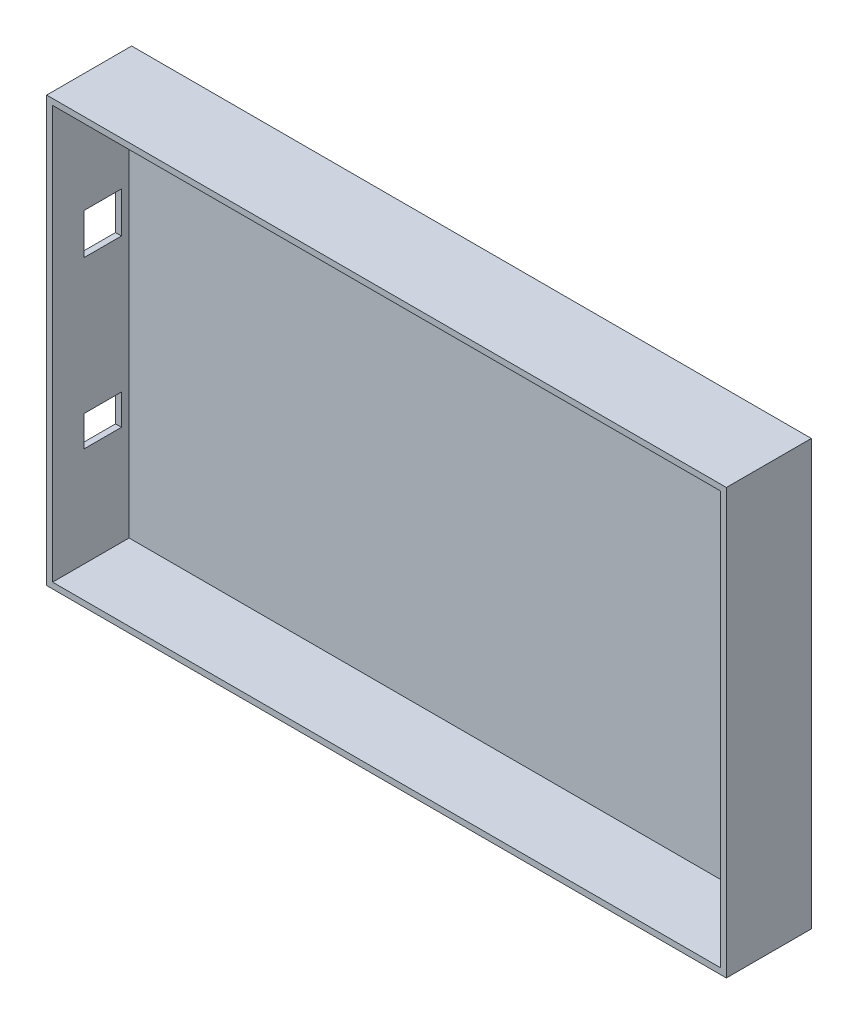
ISO-10303-21;
HEADER;
FILE_DESCRIPTION(('STEP AP214'),'2;1');
FILE_NAME('part.step','',(''),(''),'','','');
FILE_SCHEMA(('AUTOMOTIVE_DESIGN { 1 0 10303 214 1 1 1 1 }'));
ENDSEC;
DATA;
#1=APPLICATION_CONTEXT('core data for automotive mechanical design processes');
#2=APPLICATION_PROTOCOL_DEFINITION('international standard','automotive_design',2000,#1);
#3=PRODUCT_CONTEXT('',#1,'mechanical');
#4=PRODUCT('Part','Part','',(#3));
#5=PRODUCT_RELATED_PRODUCT_CATEGORY('part','',(#4));
#6=PRODUCT_DEFINITION_FORMATION('','',#4);
#7=PRODUCT_DEFINITION_CONTEXT('part definition',#1,'design');
#8=PRODUCT_DEFINITION('design','',#6,#7);
#9=PRODUCT_DEFINITION_SHAPE('','',#8);
#10=(LENGTH_UNIT() NAMED_UNIT(*) SI_UNIT(.MILLI.,.METRE.));
#11=(NAMED_UNIT(*) PLANE_ANGLE_UNIT() SI_UNIT($,.RADIAN.));
#12=(NAMED_UNIT(*) SI_UNIT($,.STERADIAN.) SOLID_ANGLE_UNIT());
#13=UNCERTAINTY_MEASURE_WITH_UNIT(LENGTH_MEASURE(1.E-05),#10,'distance_accuracy_value','');
#14=(GEOMETRIC_REPRESENTATION_CONTEXT(3) GLOBAL_UNCERTAINTY_ASSIGNED_CONTEXT((#13)) GLOBAL_UNIT_ASSIGNED_CONTEXT((#10,
#11,#12)) REPRESENTATION_CONTEXT('',''));
#15=CARTESIAN_POINT('',(0.,0.,0.));
#16=DIRECTION('',(0.,0.,1.));
#17=DIRECTION('',(1.,0.,0.));
#18=AXIS2_PLACEMENT_3D('',#15,#16,#17);
#19=CARTESIAN_POINT('',(0.,0.,25.4));
#20=DIRECTION('',(1.,0.,0.));
#21=DIRECTION('',(0.,0.,-1.));
#22=AXIS2_PLACEMENT_3D('',#19,#20,#21);
#23=PLANE('',#22);
#24=DIRECTION('',(0.,0.,-1.));
#25=VECTOR('',#24,1.);
#26=CARTESIAN_POINT('',(0.,40.7249020119005,16.002));
#27=LINE('',#26,#25);
#28=CARTESIAN_POINT('',(0.,40.7249020119005,16.002));
#29=VERTEX_POINT('',#28);
#30=CARTESIAN_POINT('',(0.,40.7249020119005,4.826));
#31=VERTEX_POINT('',#30);
#32=EDGE_CURVE('E171',#29,#31,#27,.T.);
#33=ORIENTED_EDGE('',*,*,#32,.F.);
#34=DIRECTION('',(0.,1.,0.));
#35=VECTOR('',#34,1.);
#36=CARTESIAN_POINT('',(0.,40.7249020119005,16.002));
#37=LINE('',#36,#35);
#38=CARTESIAN_POINT('',(0.,31.5809020119005,16.002));
#39=VERTEX_POINT('',#38);
#40=EDGE_CURVE('E46',#39,#29,#37,.T.);
#41=ORIENTED_EDGE('',*,*,#40,.F.);
#42=DIRECTION('',(0.,0.,1.));
#43=VECTOR('',#42,1.);
#44=CARTESIAN_POINT('',(0.,31.5809020119005,16.002));
#45=LINE('',#44,#43);
#46=CARTESIAN_POINT('',(0.,31.5809020119005,4.826));
#47=VERTEX_POINT('',#46);
#48=EDGE_CURVE('E162',#47,#39,#45,.T.);
#49=ORIENTED_EDGE('',*,*,#48,.F.);
#50=DIRECTION('',(0.,-1.,0.));
#51=VECTOR('',#50,1.);
#52=CARTESIAN_POINT('',(0.,40.7249020119005,4.826));
#53=LINE('',#52,#51);
#54=EDGE_CURVE('E165',#31,#47,#53,.T.);
#55=ORIENTED_EDGE('',*,*,#54,.F.);
#56=EDGE_LOOP('',(#33,#41,#49,#55));
#57=FACE_BOUND('',#56,.T.);
#58=DIRECTION('',(0.,0.,-1.));
#59=VECTOR('',#58,1.);
#60=CARTESIAN_POINT('',(0.,93.3029020119005,16.002));
#61=LINE('',#60,#59);
#62=CARTESIAN_POINT('',(0.,93.3029020119005,16.002));
#63=VERTEX_POINT('',#62);
#64=CARTESIAN_POINT('',(0.,93.3029020119005,4.826));
#65=VERTEX_POINT('',#64);
#66=EDGE_CURVE('E196',#63,#65,#61,.T.);
#67=ORIENTED_EDGE('',*,*,#66,.F.);
#68=DIRECTION('',(0.,1.,0.));
#69=VECTOR('',#68,1.);
#70=CARTESIAN_POINT('',(0.,93.3029020119005,16.002));
#71=LINE('',#70,#69);
#72=CARTESIAN_POINT('',(0.,81.1109020119005,16.002));
#73=VERTEX_POINT('',#72);
#74=EDGE_CURVE('E177',#73,#63,#71,.T.);
#75=ORIENTED_EDGE('',*,*,#74,.F.);
#76=DIRECTION('',(0.,0.,1.));
#77=VECTOR('',#76,1.);
#78=CARTESIAN_POINT('',(0.,81.1109020119005,16.002));
#79=LINE('',#78,#77);
#80=CARTESIAN_POINT('',(0.,81.1109020119005,4.826));
#81=VERTEX_POINT('',#80);
#82=EDGE_CURVE('E185',#81,#73,#79,.T.);
#83=ORIENTED_EDGE('',*,*,#82,.F.);
#84=DIRECTION('',(0.,-1.,0.));
#85=VECTOR('',#84,1.);
#86=CARTESIAN_POINT('',(0.,93.3029020119005,4.826));
#87=LINE('',#86,#85);
#88=EDGE_CURVE('E199',#65,#81,#87,.T.);
#89=ORIENTED_EDGE('',*,*,#88,.F.);
#90=EDGE_LOOP('',(#67,#75,#83,#89));
#91=FACE_BOUND('',#90,.T.);
#92=DIRECTION('',(0.,-1.,0.));
#93=VECTOR('',#92,1.);
#94=CARTESIAN_POINT('',(0.,0.,0.));
#95=LINE('',#94,#93);
#96=CARTESIAN_POINT('',(0.,127.,0.));
#97=VERTEX_POINT('',#96);
#98=CARTESIAN_POINT('',(0.,0.,0.));
#99=VERTEX_POINT('',#98);
#100=EDGE_CURVE('E238',#97,#99,#95,.T.);
#101=ORIENTED_EDGE('',*,*,#100,.T.);
#102=DIRECTION('',(0.,0.,-1.));
#103=VECTOR('',#102,1.);
#104=CARTESIAN_POINT('',(0.,0.,25.4));
#105=LINE('',#104,#103);
#106=CARTESIAN_POINT('',(0.,0.,25.4));
#107=VERTEX_POINT('',#106);
#108=EDGE_CURVE('E11',#107,#99,#105,.T.);
#109=ORIENTED_EDGE('',*,*,#108,.F.);
#110=DIRECTION('',(0.,-1.,0.));
#111=VECTOR('',#110,1.);
#112=CARTESIAN_POINT('',(0.,0.,25.4));
#113=LINE('',#112,#111);
#114=CARTESIAN_POINT('',(0.,127.,25.4));
#115=VERTEX_POINT('',#114);
#116=EDGE_CURVE('E245',#115,#107,#113,.T.);
#117=ORIENTED_EDGE('',*,*,#116,.F.);
#118=DIRECTION('',(0.,0.,-1.));
#119=VECTOR('',#118,1.);
#120=CARTESIAN_POINT('',(0.,127.,25.4));
#121=LINE('',#120,#119);
#122=EDGE_CURVE('E255',#115,#97,#121,.T.);
#123=ORIENTED_EDGE('',*,*,#122,.T.);
#124=EDGE_LOOP('',(#101,#109,#117,#123));
#125=FACE_BOUND('',#124,.T.);
#126=ADVANCED_FACE('F32',(#57,#91,#125),#23,.F.);
#127=CARTESIAN_POINT('',(0.,0.,25.4));
#128=DIRECTION('',(0.,1.,0.));
#129=DIRECTION('',(0.,0.,1.));
#130=AXIS2_PLACEMENT_3D('',#127,#128,#129);
#131=PLANE('',#130);
#132=DIRECTION('',(1.,0.,0.));
#133=VECTOR('',#132,1.);
#134=CARTESIAN_POINT('',(0.,0.,0.));
#135=LINE('',#134,#133);
#136=CARTESIAN_POINT('',(203.2,0.,0.));
#137=VERTEX_POINT('',#136);
#138=EDGE_CURVE('E258',#99,#137,#135,.T.);
#139=ORIENTED_EDGE('',*,*,#138,.T.);
#140=DIRECTION('',(0.,0.,-1.));
#141=VECTOR('',#140,1.);
#142=CARTESIAN_POINT('',(203.2,0.,25.4));
#143=LINE('',#142,#141);
#144=CARTESIAN_POINT('',(203.2,0.,25.4));
#145=VERTEX_POINT('',#144);
#146=EDGE_CURVE('E39',#145,#137,#143,.T.);
#147=ORIENTED_EDGE('',*,*,#146,.F.);
#148=DIRECTION('',(1.,0.,0.));
#149=VECTOR('',#148,1.);
#150=CARTESIAN_POINT('',(0.,0.,25.4));
#151=LINE('',#150,#149);
#152=EDGE_CURVE('E248',#107,#145,#151,.T.);
#153=ORIENTED_EDGE('',*,*,#152,.F.);
#154=ORIENTED_EDGE('',*,*,#108,.T.);
#155=EDGE_LOOP('',(#139,#147,#153,#154));
#156=FACE_BOUND('',#155,.T.);
#157=ADVANCED_FACE('F288',(#156),#131,.F.);
#158=CARTESIAN_POINT('',(203.2,0.,25.4));
#159=DIRECTION('',(-1.,0.,0.));
#160=DIRECTION('',(0.,0.,1.));
#161=AXIS2_PLACEMENT_3D('',#158,#159,#160);
#162=PLANE('',#161);
#163=DIRECTION('',(0.,1.,0.));
#164=VECTOR('',#163,1.);
#165=CARTESIAN_POINT('',(203.2,0.,0.));
#166=LINE('',#165,#164);
#167=CARTESIAN_POINT('',(203.2,127.,0.));
#168=VERTEX_POINT('',#167);
#169=EDGE_CURVE('E260',#137,#168,#166,.T.);
#170=ORIENTED_EDGE('',*,*,#169,.T.);
#171=DIRECTION('',(0.,0.,-1.));
#172=VECTOR('',#171,1.);
#173=CARTESIAN_POINT('',(203.2,127.,25.4));
#174=LINE('',#173,#172);
#175=CARTESIAN_POINT('',(203.2,127.,25.4));
#176=VERTEX_POINT('',#175);
#177=EDGE_CURVE('E265',#176,#168,#174,.T.);
#178=ORIENTED_EDGE('',*,*,#177,.F.);
#179=DIRECTION('',(0.,1.,0.));
#180=VECTOR('',#179,1.);
#181=CARTESIAN_POINT('',(203.2,0.,25.4));
#182=LINE('',#181,#180);
#183=EDGE_CURVE('E251',#145,#176,#182,.T.);
#184=ORIENTED_EDGE('',*,*,#183,.F.);
#185=ORIENTED_EDGE('',*,*,#146,.T.);
#186=EDGE_LOOP('',(#170,#178,#184,#185));
#187=FACE_BOUND('',#186,.T.);
#188=ADVANCED_FACE('F272',(#187),#162,.F.);
#189=CARTESIAN_POINT('',(0.,127.,25.4));
#190=DIRECTION('',(0.,-1.,0.));
#191=DIRECTION('',(0.,0.,-1.));
#192=AXIS2_PLACEMENT_3D('',#189,#190,#191);
#193=PLANE('',#192);
#194=DIRECTION('',(-1.,0.,0.));
#195=VECTOR('',#194,1.);
#196=CARTESIAN_POINT('',(0.,127.,0.));
#197=LINE('',#196,#195);
#198=EDGE_CURVE('E249',#168,#97,#197,.T.);
#199=ORIENTED_EDGE('',*,*,#198,.T.);
#200=ORIENTED_EDGE('',*,*,#122,.F.);
#201=DIRECTION('',(-1.,0.,0.));
#202=VECTOR('',#201,1.);
#203=CARTESIAN_POINT('',(0.,127.,25.4));
#204=LINE('',#203,#202);
#205=EDGE_CURVE('E253',#176,#115,#204,.T.);
#206=ORIENTED_EDGE('',*,*,#205,.F.);
#207=ORIENTED_EDGE('',*,*,#177,.T.);
#208=EDGE_LOOP('',(#199,#200,#206,#207));
#209=FACE_BOUND('',#208,.T.);
#210=ADVANCED_FACE('F281',(#209),#193,.F.);
#211=CARTESIAN_POINT('',(0.,0.,25.4));
#212=DIRECTION('',(0.,0.,-1.));
#213=DIRECTION('',(-1.,0.,0.));
#214=AXIS2_PLACEMENT_3D('',#211,#212,#213);
#215=PLANE('',#214);
#216=DIRECTION('',(1.,0.,0.));
#217=VECTOR('',#216,1.);
#218=CARTESIAN_POINT('',(1.77800000000001,1.778,25.4));
#219=LINE('',#218,#217);
#220=CARTESIAN_POINT('',(1.77800000000001,1.778,25.4));
#221=VERTEX_POINT('',#220);
#222=CARTESIAN_POINT('',(201.422,1.778,25.4));
#223=VERTEX_POINT('',#222);
#224=EDGE_CURVE('E228',#221,#223,#219,.T.);
#225=ORIENTED_EDGE('',*,*,#224,.F.);
#226=DIRECTION('',(0.,-1.,0.));
#227=VECTOR('',#226,1.);
#228=CARTESIAN_POINT('',(1.77799999999997,125.222,25.4));
#229=LINE('',#228,#227);
#230=CARTESIAN_POINT('',(1.77799999999997,125.222,25.4));
#231=VERTEX_POINT('',#230);
#232=EDGE_CURVE('E206',#231,#221,#229,.T.);
#233=ORIENTED_EDGE('',*,*,#232,.F.);
#234=DIRECTION('',(-1.,0.,0.));
#235=VECTOR('',#234,1.);
#236=CARTESIAN_POINT('',(1.77799999999997,125.222,25.4));
#237=LINE('',#236,#235);
#238=CARTESIAN_POINT('',(201.422,125.222,25.4));
#239=VERTEX_POINT('',#238);
#240=EDGE_CURVE('E217',#239,#231,#237,.T.);
#241=ORIENTED_EDGE('',*,*,#240,.F.);
#242=DIRECTION('',(0.,1.,0.));
#243=VECTOR('',#242,1.);
#244=CARTESIAN_POINT('',(201.422,125.222,25.4));
#245=LINE('',#244,#243);
#246=EDGE_CURVE('E231',#223,#239,#245,.T.);
#247=ORIENTED_EDGE('',*,*,#246,.F.);
#248=EDGE_LOOP('',(#225,#233,#241,#247));
#249=FACE_BOUND('',#248,.T.);
#250=ORIENTED_EDGE('',*,*,#116,.T.);
#251=ORIENTED_EDGE('',*,*,#152,.T.);
#252=ORIENTED_EDGE('',*,*,#183,.T.);
#253=ORIENTED_EDGE('',*,*,#205,.T.);
#254=EDGE_LOOP('',(#250,#251,#252,#253));
#255=FACE_BOUND('',#254,.T.);
#256=ADVANCED_FACE('F287',(#249,#255),#215,.F.);
#257=CARTESIAN_POINT('',(0.,0.,0.));
#258=DIRECTION('',(0.,0.,-1.));
#259=DIRECTION('',(-1.,0.,0.));
#260=AXIS2_PLACEMENT_3D('',#257,#258,#259);
#261=PLANE('',#260);
#262=ORIENTED_EDGE('',*,*,#100,.F.);
#263=ORIENTED_EDGE('',*,*,#198,.F.);
#264=ORIENTED_EDGE('',*,*,#169,.F.);
#265=ORIENTED_EDGE('',*,*,#138,.F.);
#266=EDGE_LOOP('',(#262,#263,#264,#265));
#267=FACE_BOUND('',#266,.T.);
#268=ADVANCED_FACE('F278',(#267),#261,.T.);
#269=CARTESIAN_POINT('',(1.77799999999997,125.222,2.54));
#270=DIRECTION('',(-1.,0.,0.));
#271=DIRECTION('',(0.,-1.,0.));
#272=AXIS2_PLACEMENT_3D('',#269,#270,#271);
#273=PLANE('',#272);
#274=DIRECTION('',(0.,0.,1.));
#275=VECTOR('',#274,1.);
#276=CARTESIAN_POINT('',(1.778,31.5809020119005,16.002));
#277=LINE('',#276,#275);
#278=CARTESIAN_POINT('',(1.778,31.5809020119005,4.826));
#279=VERTEX_POINT('',#278);
#280=CARTESIAN_POINT('',(1.778,31.5809020119005,16.002));
#281=VERTEX_POINT('',#280);
#282=EDGE_CURVE('E152',#279,#281,#277,.T.);
#283=ORIENTED_EDGE('',*,*,#282,.T.);
#284=DIRECTION('',(0.,1.,0.));
#285=VECTOR('',#284,1.);
#286=CARTESIAN_POINT('',(1.778,40.7249020119005,16.002));
#287=LINE('',#286,#285);
#288=CARTESIAN_POINT('',(1.778,40.7249020119005,16.002));
#289=VERTEX_POINT('',#288);
#290=EDGE_CURVE('E146',#281,#289,#287,.T.);
#291=ORIENTED_EDGE('',*,*,#290,.T.);
#292=DIRECTION('',(0.,0.,-1.));
#293=VECTOR('',#292,1.);
#294=CARTESIAN_POINT('',(1.778,40.7249020119005,16.002));
#295=LINE('',#294,#293);
#296=CARTESIAN_POINT('',(1.778,40.7249020119005,4.826));
#297=VERTEX_POINT('',#296);
#298=EDGE_CURVE('E155',#289,#297,#295,.T.);
#299=ORIENTED_EDGE('',*,*,#298,.T.);
#300=DIRECTION('',(0.,-1.,0.));
#301=VECTOR('',#300,1.);
#302=CARTESIAN_POINT('',(1.778,40.7249020119005,4.826));
#303=LINE('',#302,#301);
#304=EDGE_CURVE('E54',#297,#279,#303,.T.);
#305=ORIENTED_EDGE('',*,*,#304,.T.);
#306=EDGE_LOOP('',(#283,#291,#299,#305));
#307=FACE_BOUND('',#306,.T.);
#308=DIRECTION('',(0.,0.,1.));
#309=VECTOR('',#308,1.);
#310=CARTESIAN_POINT('',(1.778,81.1109020119005,16.002));
#311=LINE('',#310,#309);
#312=CARTESIAN_POINT('',(1.778,81.1109020119005,4.826));
#313=VERTEX_POINT('',#312);
#314=CARTESIAN_POINT('',(1.778,81.1109020119005,16.002));
#315=VERTEX_POINT('',#314);
#316=EDGE_CURVE('E191',#313,#315,#311,.T.);
#317=ORIENTED_EDGE('',*,*,#316,.T.);
#318=DIRECTION('',(0.,1.,0.));
#319=VECTOR('',#318,1.);
#320=CARTESIAN_POINT('',(1.778,93.3029020119005,16.002));
#321=LINE('',#320,#319);
#322=CARTESIAN_POINT('',(1.778,93.3029020119005,16.002));
#323=VERTEX_POINT('',#322);
#324=EDGE_CURVE('E181',#315,#323,#321,.T.);
#325=ORIENTED_EDGE('',*,*,#324,.T.);
#326=DIRECTION('',(0.,0.,-1.));
#327=VECTOR('',#326,1.);
#328=CARTESIAN_POINT('',(1.778,93.3029020119005,16.002));
#329=LINE('',#328,#327);
#330=CARTESIAN_POINT('',(1.77799999999998,93.3029020119005,4.826));
#331=VERTEX_POINT('',#330);
#332=EDGE_CURVE('E184',#323,#331,#329,.T.);
#333=ORIENTED_EDGE('',*,*,#332,.T.);
#334=DIRECTION('',(0.,-1.,0.));
#335=VECTOR('',#334,1.);
#336=CARTESIAN_POINT('',(1.778,93.3029020119005,4.826));
#337=LINE('',#336,#335);
#338=EDGE_CURVE('E188',#331,#313,#337,.T.);
#339=ORIENTED_EDGE('',*,*,#338,.T.);
#340=EDGE_LOOP('',(#317,#325,#333,#339));
#341=FACE_BOUND('',#340,.T.);
#342=ORIENTED_EDGE('',*,*,#232,.T.);
#343=DIRECTION('',(0.,0.,1.));
#344=VECTOR('',#343,1.);
#345=CARTESIAN_POINT('',(1.77800000000001,1.778,2.54));
#346=LINE('',#345,#344);
#347=CARTESIAN_POINT('',(1.77800000000001,1.778,2.54));
#348=VERTEX_POINT('',#347);
#349=EDGE_CURVE('E226',#348,#221,#346,.T.);
#350=ORIENTED_EDGE('',*,*,#349,.F.);
#351=DIRECTION('',(0.,-1.,0.));
#352=VECTOR('',#351,1.);
#353=CARTESIAN_POINT('',(1.77799999999997,125.222,2.54));
#354=LINE('',#353,#352);
#355=CARTESIAN_POINT('',(1.77799999999997,125.222,2.54));
#356=VERTEX_POINT('',#355);
#357=EDGE_CURVE('E213',#356,#348,#354,.T.);
#358=ORIENTED_EDGE('',*,*,#357,.F.);
#359=DIRECTION('',(0.,0.,1.));
#360=VECTOR('',#359,1.);
#361=CARTESIAN_POINT('',(1.77799999999997,125.222,2.54));
#362=LINE('',#361,#360);
#363=EDGE_CURVE('E236',#356,#231,#362,.T.);
#364=ORIENTED_EDGE('',*,*,#363,.T.);
#365=EDGE_LOOP('',(#342,#350,#358,#364));
#366=FACE_BOUND('',#365,.T.);
#367=ADVANCED_FACE('F159',(#307,#341,#366),#273,.F.);
#368=CARTESIAN_POINT('',(1.77799999999997,125.222,2.54));
#369=DIRECTION('',(0.,1.,0.));
#370=DIRECTION('',(0.,0.,1.));
#371=AXIS2_PLACEMENT_3D('',#368,#369,#370);
#372=PLANE('',#371);
#373=ORIENTED_EDGE('',*,*,#240,.T.);
#374=ORIENTED_EDGE('',*,*,#363,.F.);
#375=DIRECTION('',(-1.,0.,0.));
#376=VECTOR('',#375,1.);
#377=CARTESIAN_POINT('',(1.77799999999997,125.222,2.54));
#378=LINE('',#377,#376);
#379=CARTESIAN_POINT('',(201.422,125.222,2.54));
#380=VERTEX_POINT('',#379);
#381=EDGE_CURVE('E223',#380,#356,#378,.T.);
#382=ORIENTED_EDGE('',*,*,#381,.F.);
#383=DIRECTION('',(0.,0.,1.));
#384=VECTOR('',#383,1.);
#385=CARTESIAN_POINT('',(201.422,125.222,2.54));
#386=LINE('',#385,#384);
#387=EDGE_CURVE('E239',#380,#239,#386,.T.);
#388=ORIENTED_EDGE('',*,*,#387,.T.);
#389=EDGE_LOOP('',(#373,#374,#382,#388));
#390=FACE_BOUND('',#389,.T.);
#391=ADVANCED_FACE('F306',(#390),#372,.F.);
#392=CARTESIAN_POINT('',(201.422,125.222,2.54));
#393=DIRECTION('',(1.,0.,0.));
#394=DIRECTION('',(0.,1.,0.));
#395=AXIS2_PLACEMENT_3D('',#392,#393,#394);
#396=PLANE('',#395);
#397=ORIENTED_EDGE('',*,*,#246,.T.);
#398=ORIENTED_EDGE('',*,*,#387,.F.);
#399=DIRECTION('',(0.,1.,0.));
#400=VECTOR('',#399,1.);
#401=CARTESIAN_POINT('',(201.422,125.222,2.54));
#402=LINE('',#401,#400);
#403=CARTESIAN_POINT('',(201.422,1.778,2.54));
#404=VERTEX_POINT('',#403);
#405=EDGE_CURVE('E220',#404,#380,#402,.T.);
#406=ORIENTED_EDGE('',*,*,#405,.F.);
#407=DIRECTION('',(0.,0.,1.));
#408=VECTOR('',#407,1.);
#409=CARTESIAN_POINT('',(201.422,1.778,2.54));
#410=LINE('',#409,#408);
#411=EDGE_CURVE('E241',#404,#223,#410,.T.);
#412=ORIENTED_EDGE('',*,*,#411,.T.);
#413=EDGE_LOOP('',(#397,#398,#406,#412));
#414=FACE_BOUND('',#413,.T.);
#415=ADVANCED_FACE('F311',(#414),#396,.F.);
#416=CARTESIAN_POINT('',(1.77800000000001,1.778,2.54));
#417=DIRECTION('',(0.,-1.,0.));
#418=DIRECTION('',(0.,0.,-1.));
#419=AXIS2_PLACEMENT_3D('',#416,#417,#418);
#420=PLANE('',#419);
#421=ORIENTED_EDGE('',*,*,#224,.T.);
#422=ORIENTED_EDGE('',*,*,#411,.F.);
#423=DIRECTION('',(1.,0.,0.));
#424=VECTOR('',#423,1.);
#425=CARTESIAN_POINT('',(1.77800000000001,1.778,2.54));
#426=LINE('',#425,#424);
#427=EDGE_CURVE('E216',#348,#404,#426,.T.);
#428=ORIENTED_EDGE('',*,*,#427,.F.);
#429=ORIENTED_EDGE('',*,*,#349,.T.);
#430=EDGE_LOOP('',(#421,#422,#428,#429));
#431=FACE_BOUND('',#430,.T.);
#432=ADVANCED_FACE('F307',(#431),#420,.F.);
#433=CARTESIAN_POINT('',(0.,0.,2.54));
#434=DIRECTION('',(0.,0.,1.));
#435=DIRECTION('',(1.,0.,0.));
#436=AXIS2_PLACEMENT_3D('',#433,#434,#435);
#437=PLANE('',#436);
#438=ORIENTED_EDGE('',*,*,#357,.T.);
#439=ORIENTED_EDGE('',*,*,#427,.T.);
#440=ORIENTED_EDGE('',*,*,#405,.T.);
#441=ORIENTED_EDGE('',*,*,#381,.T.);
#442=EDGE_LOOP('',(#438,#439,#440,#441));
#443=FACE_BOUND('',#442,.T.);
#444=ADVANCED_FACE('F310',(#443),#437,.T.);
#445=CARTESIAN_POINT('',(1.778,93.3029020119005,16.002));
#446=DIRECTION('',(0.,0.,1.));
#447=DIRECTION('',(1.,0.,0.));
#448=AXIS2_PLACEMENT_3D('',#445,#446,#447);
#449=PLANE('',#448);
#450=ORIENTED_EDGE('',*,*,#74,.T.);
#451=DIRECTION('',(-1.,0.,0.));
#452=VECTOR('',#451,1.);
#453=CARTESIAN_POINT('',(1.778,93.3029020119005,16.002));
#454=LINE('',#453,#452);
#455=EDGE_CURVE('E194',#323,#63,#454,.T.);
#456=ORIENTED_EDGE('',*,*,#455,.F.);
#457=ORIENTED_EDGE('',*,*,#324,.F.);
#458=DIRECTION('',(-1.,0.,0.));
#459=VECTOR('',#458,1.);
#460=CARTESIAN_POINT('',(1.778,81.1109020119005,16.002));
#461=LINE('',#460,#459);
#462=EDGE_CURVE('E204',#315,#73,#461,.T.);
#463=ORIENTED_EDGE('',*,*,#462,.T.);
#464=EDGE_LOOP('',(#450,#456,#457,#463));
#465=FACE_BOUND('',#464,.T.);
#466=ADVANCED_FACE('F321',(#465),#449,.F.);
#467=CARTESIAN_POINT('',(1.778,81.1109020119005,16.002));
#468=DIRECTION('',(0.,-1.,0.));
#469=DIRECTION('',(0.,0.,-1.));
#470=AXIS2_PLACEMENT_3D('',#467,#468,#469);
#471=PLANE('',#470);
#472=ORIENTED_EDGE('',*,*,#82,.T.);
#473=ORIENTED_EDGE('',*,*,#462,.F.);
#474=ORIENTED_EDGE('',*,*,#316,.F.);
#475=DIRECTION('',(-1.,0.,0.));
#476=VECTOR('',#475,1.);
#477=CARTESIAN_POINT('',(1.778,81.1109020119005,4.826));
#478=LINE('',#477,#476);
#479=EDGE_CURVE('E207',#313,#81,#478,.T.);
#480=ORIENTED_EDGE('',*,*,#479,.T.);
#481=EDGE_LOOP('',(#472,#473,#474,#480));
#482=FACE_BOUND('',#481,.T.);
#483=ADVANCED_FACE('F325',(#482),#471,.F.);
#484=CARTESIAN_POINT('',(1.778,93.3029020119005,4.826));
#485=DIRECTION('',(0.,0.,-1.));
#486=DIRECTION('',(0.,1.,0.));
#487=AXIS2_PLACEMENT_3D('',#484,#485,#486);
#488=PLANE('',#487);
#489=ORIENTED_EDGE('',*,*,#88,.T.);
#490=ORIENTED_EDGE('',*,*,#479,.F.);
#491=ORIENTED_EDGE('',*,*,#338,.F.);
#492=DIRECTION('',(-1.,0.,0.));
#493=VECTOR('',#492,1.);
#494=CARTESIAN_POINT('',(1.778,93.3029020119005,4.826));
#495=LINE('',#494,#493);
#496=EDGE_CURVE('E209',#331,#65,#495,.T.);
#497=ORIENTED_EDGE('',*,*,#496,.T.);
#498=EDGE_LOOP('',(#489,#490,#491,#497));
#499=FACE_BOUND('',#498,.T.);
#500=ADVANCED_FACE('F330',(#499),#488,.F.);
#501=CARTESIAN_POINT('',(1.778,93.3029020119005,16.002));
#502=DIRECTION('',(0.,1.,0.));
#503=DIRECTION('',(0.,0.,1.));
#504=AXIS2_PLACEMENT_3D('',#501,#502,#503);
#505=PLANE('',#504);
#506=ORIENTED_EDGE('',*,*,#66,.T.);
#507=ORIENTED_EDGE('',*,*,#496,.F.);
#508=ORIENTED_EDGE('',*,*,#332,.F.);
#509=ORIENTED_EDGE('',*,*,#455,.T.);
#510=EDGE_LOOP('',(#506,#507,#508,#509));
#511=FACE_BOUND('',#510,.T.);
#512=ADVANCED_FACE('F327',(#511),#505,.F.);
#513=CARTESIAN_POINT('',(1.778,40.7249020119005,16.002));
#514=DIRECTION('',(0.,0.,1.));
#515=DIRECTION('',(0.,-1.,0.));
#516=AXIS2_PLACEMENT_3D('',#513,#514,#515);
#517=PLANE('',#516);
#518=ORIENTED_EDGE('',*,*,#40,.T.);
#519=DIRECTION('',(-1.,0.,0.));
#520=VECTOR('',#519,1.);
#521=CARTESIAN_POINT('',(1.778,40.7249020119005,16.002));
#522=LINE('',#521,#520);
#523=EDGE_CURVE('E142',#289,#29,#522,.T.);
#524=ORIENTED_EDGE('',*,*,#523,.F.);
#525=ORIENTED_EDGE('',*,*,#290,.F.);
#526=DIRECTION('',(-1.,0.,0.));
#527=VECTOR('',#526,1.);
#528=CARTESIAN_POINT('',(1.778,31.5809020119005,16.002));
#529=LINE('',#528,#527);
#530=EDGE_CURVE('E175',#281,#39,#529,.T.);
#531=ORIENTED_EDGE('',*,*,#530,.T.);
#532=EDGE_LOOP('',(#518,#524,#525,#531));
#533=FACE_BOUND('',#532,.T.);
#534=ADVANCED_FACE('F144',(#533),#517,.F.);
#535=CARTESIAN_POINT('',(1.778,31.5809020119005,16.002));
#536=DIRECTION('',(0.,-1.,0.));
#537=DIRECTION('',(0.,0.,-1.));
#538=AXIS2_PLACEMENT_3D('',#535,#536,#537);
#539=PLANE('',#538);
#540=ORIENTED_EDGE('',*,*,#48,.T.);
#541=ORIENTED_EDGE('',*,*,#530,.F.);
#542=ORIENTED_EDGE('',*,*,#282,.F.);
#543=DIRECTION('',(-1.,0.,0.));
#544=VECTOR('',#543,1.);
#545=CARTESIAN_POINT('',(1.778,31.5809020119005,4.826));
#546=LINE('',#545,#544);
#547=EDGE_CURVE('E178',#279,#47,#546,.T.);
#548=ORIENTED_EDGE('',*,*,#547,.T.);
#549=EDGE_LOOP('',(#540,#541,#542,#548));
#550=FACE_BOUND('',#549,.T.);
#551=ADVANCED_FACE('F340',(#550),#539,.F.);
#552=CARTESIAN_POINT('',(1.778,40.7249020119005,4.826));
#553=DIRECTION('',(0.,0.,-1.));
#554=DIRECTION('',(0.,1.,0.));
#555=AXIS2_PLACEMENT_3D('',#552,#553,#554);
#556=PLANE('',#555);
#557=ORIENTED_EDGE('',*,*,#54,.T.);
#558=ORIENTED_EDGE('',*,*,#547,.F.);
#559=ORIENTED_EDGE('',*,*,#304,.F.);
#560=DIRECTION('',(-1.,0.,0.));
#561=VECTOR('',#560,1.);
#562=CARTESIAN_POINT('',(1.778,40.7249020119005,4.826));
#563=LINE('',#562,#561);
#564=EDGE_CURVE('E151',#297,#31,#563,.T.);
#565=ORIENTED_EDGE('',*,*,#564,.T.);
#566=EDGE_LOOP('',(#557,#558,#559,#565));
#567=FACE_BOUND('',#566,.T.);
#568=ADVANCED_FACE('F343',(#567),#556,.F.);
#569=CARTESIAN_POINT('',(1.778,40.7249020119005,16.002));
#570=DIRECTION('',(0.,1.,0.));
#571=DIRECTION('',(0.,0.,1.));
#572=AXIS2_PLACEMENT_3D('',#569,#570,#571);
#573=PLANE('',#572);
#574=ORIENTED_EDGE('',*,*,#32,.T.);
#575=ORIENTED_EDGE('',*,*,#564,.F.);
#576=ORIENTED_EDGE('',*,*,#298,.F.);
#577=ORIENTED_EDGE('',*,*,#523,.T.);
#578=EDGE_LOOP('',(#574,#575,#576,#577));
#579=FACE_BOUND('',#578,.T.);
#580=ADVANCED_FACE('F156',(#579),#573,.F.);
#581=CLOSED_SHELL('',(#126,#157,#188,#210,#256,#268,#367,#391,#415,#432,#444,#466,#483,#500,
#512,#534,#551,#568,#580));
#582=MANIFOLD_SOLID_BREP('B2',#581);
#583=ADVANCED_BREP_SHAPE_REPRESENTATION('',(#18,#582),#14);
#584=SHAPE_DEFINITION_REPRESENTATION(#9,#583);
ENDSEC;
END-ISO-10303-21;
